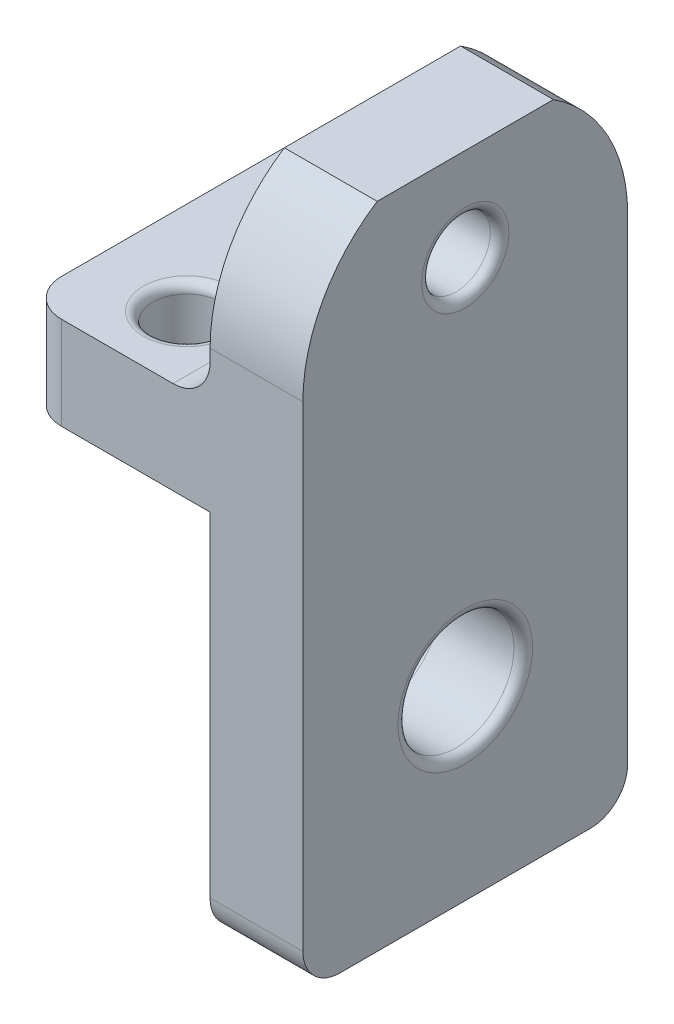
ISO-10303-21;
HEADER;
FILE_DESCRIPTION(('STEP AP214'),'2;1');
FILE_NAME('part.step','',(''),(''),'','','');
FILE_SCHEMA(('AUTOMOTIVE_DESIGN { 1 0 10303 214 1 1 1 1 }'));
ENDSEC;
DATA;
#1=APPLICATION_CONTEXT('core data for automotive mechanical design processes');
#2=APPLICATION_PROTOCOL_DEFINITION('international standard','automotive_design',2000,#1);
#3=PRODUCT_CONTEXT('',#1,'mechanical');
#4=PRODUCT('Part','Part','',(#3));
#5=PRODUCT_RELATED_PRODUCT_CATEGORY('part','',(#4));
#6=PRODUCT_DEFINITION_FORMATION('','',#4);
#7=PRODUCT_DEFINITION_CONTEXT('part definition',#1,'design');
#8=PRODUCT_DEFINITION('design','',#6,#7);
#9=PRODUCT_DEFINITION_SHAPE('','',#8);
#10=(LENGTH_UNIT() NAMED_UNIT(*) SI_UNIT(.MILLI.,.METRE.));
#11=(NAMED_UNIT(*) PLANE_ANGLE_UNIT() SI_UNIT($,.RADIAN.));
#12=(NAMED_UNIT(*) SI_UNIT($,.STERADIAN.) SOLID_ANGLE_UNIT());
#13=UNCERTAINTY_MEASURE_WITH_UNIT(LENGTH_MEASURE(1.E-05),#10,'distance_accuracy_value','');
#14=(GEOMETRIC_REPRESENTATION_CONTEXT(3) GLOBAL_UNCERTAINTY_ASSIGNED_CONTEXT((#13)) GLOBAL_UNIT_ASSIGNED_CONTEXT((#10,
#11,#12)) REPRESENTATION_CONTEXT('',''));
#15=CARTESIAN_POINT('',(0.,0.,0.));
#16=DIRECTION('',(0.,0.,1.));
#17=DIRECTION('',(1.,0.,0.));
#18=AXIS2_PLACEMENT_3D('',#15,#16,#17);
#19=CARTESIAN_POINT('',(0.,0.,-11.1125));
#20=DIRECTION('',(0.,0.,1.));
#21=DIRECTION('',(1.,0.,0.));
#22=AXIS2_PLACEMENT_3D('',#19,#20,#21);
#23=PLANE('',#22);
#24=DIRECTION('',(1.,0.,0.));
#25=VECTOR('',#24,1.);
#26=CARTESIAN_POINT('',(-12.7,9.7155,-11.1125));
#27=LINE('',#26,#25);
#28=CARTESIAN_POINT('',(6.35,9.7155,-11.1125));
#29=VERTEX_POINT('',#28);
#30=CARTESIAN_POINT('',(0.,9.7155,-11.1125));
#31=VERTEX_POINT('',#30);
#32=EDGE_CURVE('E11',#29,#31,#27,.F.);
#33=ORIENTED_EDGE('',*,*,#32,.F.);
#34=DIRECTION('',(0.,1.,0.));
#35=VECTOR('',#34,1.);
#36=CARTESIAN_POINT('',(6.35,19.05,-11.1125));
#37=LINE('',#36,#35);
#38=CARTESIAN_POINT('',(6.35000000000001,-22.86,-11.1125));
#39=VERTEX_POINT('',#38);
#40=EDGE_CURVE('E191',#39,#29,#37,.T.);
#41=ORIENTED_EDGE('',*,*,#40,.F.);
#42=DIRECTION('',(1.,0.,0.));
#43=VECTOR('',#42,1.);
#44=CARTESIAN_POINT('',(0.,-22.86,-11.1125));
#45=LINE('',#44,#43);
#46=CARTESIAN_POINT('',(0.,-22.86,-11.1125));
#47=VERTEX_POINT('',#46);
#48=EDGE_CURVE('E282',#39,#47,#45,.F.);
#49=ORIENTED_EDGE('',*,*,#48,.T.);
#50=DIRECTION('',(0.,-1.,0.));
#51=VECTOR('',#50,1.);
#52=CARTESIAN_POINT('',(0.,-25.4,-11.1125));
#53=LINE('',#52,#51);
#54=CARTESIAN_POINT('',(0.,0.,-11.1125));
#55=VERTEX_POINT('',#54);
#56=EDGE_CURVE('E164',#55,#47,#53,.T.);
#57=ORIENTED_EDGE('',*,*,#56,.F.);
#58=DIRECTION('',(1.,0.,0.));
#59=VECTOR('',#58,1.);
#60=CARTESIAN_POINT('',(0.,0.,-11.1125));
#61=LINE('',#60,#59);
#62=CARTESIAN_POINT('',(-10.16,0.,-11.1125));
#63=VERTEX_POINT('',#62);
#64=EDGE_CURVE('E176',#63,#55,#61,.T.);
#65=ORIENTED_EDGE('',*,*,#64,.F.);
#66=DIRECTION('',(0.,-1.,0.));
#67=VECTOR('',#66,1.);
#68=CARTESIAN_POINT('',(-10.16,0.,-11.1125));
#69=LINE('',#68,#67);
#70=CARTESIAN_POINT('',(-10.16,6.35,-11.1125));
#71=VERTEX_POINT('',#70);
#72=EDGE_CURVE('E279',#63,#71,#69,.F.);
#73=ORIENTED_EDGE('',*,*,#72,.T.);
#74=DIRECTION('',(-1.,0.,0.));
#75=VECTOR('',#74,1.);
#76=CARTESIAN_POINT('',(-12.7,6.35,-11.1125));
#77=LINE('',#76,#75);
#78=CARTESIAN_POINT('',(-2.54,6.35,-11.1125));
#79=VERTEX_POINT('',#78);
#80=EDGE_CURVE('E179',#79,#71,#77,.T.);
#81=ORIENTED_EDGE('',*,*,#80,.F.);
#82=CARTESIAN_POINT('',(-2.54,8.89,-11.1125));
#83=DIRECTION('',(0.,0.,1.));
#84=DIRECTION('',(1.,0.,0.));
#85=AXIS2_PLACEMENT_3D('',#82,#83,#84);
#86=CIRCLE('',#85,2.54);
#87=CARTESIAN_POINT('',(0.,8.89,-11.1125));
#88=VERTEX_POINT('',#87);
#89=EDGE_CURVE('E200',#79,#88,#86,.T.);
#90=ORIENTED_EDGE('',*,*,#89,.T.);
#91=DIRECTION('',(0.,-1.,0.));
#92=VECTOR('',#91,1.);
#93=CARTESIAN_POINT('',(0.,6.35,-11.1125));
#94=LINE('',#93,#92);
#95=EDGE_CURVE('E194',#31,#88,#94,.T.);
#96=ORIENTED_EDGE('',*,*,#95,.F.);
#97=EDGE_LOOP('',(#33,#41,#49,#57,#65,#73,#81,#90,#96));
#98=FACE_BOUND('',#97,.T.);
#99=ADVANCED_FACE('F41',(#98),#23,.F.);
#100=CARTESIAN_POINT('',(0.,-25.4,11.1125));
#101=DIRECTION('',(1.,0.,0.));
#102=DIRECTION('',(0.,0.,-1.));
#103=AXIS2_PLACEMENT_3D('',#100,#101,#102);
#104=PLANE('',#103);
#105=CARTESIAN_POINT('',(0.,-12.7,0.));
#106=DIRECTION('',(1.,0.,0.));
#107=DIRECTION('',(0.,0.,-1.));
#108=AXIS2_PLACEMENT_3D('',#105,#106,#107);
#109=CIRCLE('',#108,4.60375);
#110=CARTESIAN_POINT('',(0.,-12.7,-4.60375));
#111=VERTEX_POINT('',#110);
#112=EDGE_CURVE('E215',#111,#111,#109,.T.);
#113=ORIENTED_EDGE('',*,*,#112,.T.);
#114=EDGE_LOOP('',(#113));
#115=FACE_BOUND('',#114,.T.);
#116=ORIENTED_EDGE('',*,*,#56,.T.);
#117=CARTESIAN_POINT('',(0.,-22.86,-8.5725));
#118=DIRECTION('',(1.,0.,0.));
#119=DIRECTION('',(0.,0.,-1.));
#120=AXIS2_PLACEMENT_3D('',#117,#118,#119);
#121=CIRCLE('',#120,2.54);
#122=CARTESIAN_POINT('',(0.,-25.4,-8.5725));
#123=VERTEX_POINT('',#122);
#124=EDGE_CURVE('E257',#47,#123,#121,.F.);
#125=ORIENTED_EDGE('',*,*,#124,.T.);
#126=DIRECTION('',(0.,0.,-1.));
#127=VECTOR('',#126,1.);
#128=CARTESIAN_POINT('',(0.,-25.4,11.1125));
#129=LINE('',#128,#127);
#130=CARTESIAN_POINT('',(0.,-25.4,8.5725));
#131=VERTEX_POINT('',#130);
#132=EDGE_CURVE('E293',#131,#123,#129,.T.);
#133=ORIENTED_EDGE('',*,*,#132,.F.);
#134=CARTESIAN_POINT('',(0.,-22.86,8.5725));
#135=DIRECTION('',(1.,0.,0.));
#136=DIRECTION('',(0.,0.,-1.));
#137=AXIS2_PLACEMENT_3D('',#134,#135,#136);
#138=CIRCLE('',#137,2.54);
#139=CARTESIAN_POINT('',(0.,-22.86,11.1125));
#140=VERTEX_POINT('',#139);
#141=EDGE_CURVE('E259',#131,#140,#138,.F.);
#142=ORIENTED_EDGE('',*,*,#141,.T.);
#143=DIRECTION('',(0.,-1.,0.));
#144=VECTOR('',#143,1.);
#145=CARTESIAN_POINT('',(0.,-25.4,11.1125));
#146=LINE('',#145,#144);
#147=CARTESIAN_POINT('',(0.,0.,11.1125));
#148=VERTEX_POINT('',#147);
#149=EDGE_CURVE('E173',#148,#140,#146,.T.);
#150=ORIENTED_EDGE('',*,*,#149,.F.);
#151=DIRECTION('',(0.,0.,-1.));
#152=VECTOR('',#151,1.);
#153=CARTESIAN_POINT('',(0.,0.,11.1125));
#154=LINE('',#153,#152);
#155=EDGE_CURVE('E188',#148,#55,#154,.T.);
#156=ORIENTED_EDGE('',*,*,#155,.T.);
#157=EDGE_LOOP('',(#116,#125,#133,#142,#150,#156));
#158=FACE_BOUND('',#157,.T.);
#159=ADVANCED_FACE('F337',(#115,#158),#104,.F.);
#160=CARTESIAN_POINT('',(6.35000000000001,-25.4,11.1125));
#161=DIRECTION('',(0.,1.,0.));
#162=DIRECTION('',(0.,0.,1.));
#163=AXIS2_PLACEMENT_3D('',#160,#161,#162);
#164=PLANE('',#163);
#165=ORIENTED_EDGE('',*,*,#132,.T.);
#166=DIRECTION('',(1.,0.,0.));
#167=VECTOR('',#166,1.);
#168=CARTESIAN_POINT('',(6.35000000000001,-25.4,-8.5725));
#169=LINE('',#168,#167);
#170=CARTESIAN_POINT('',(6.35000000000001,-25.4,-8.5725));
#171=VERTEX_POINT('',#170);
#172=EDGE_CURVE('E265',#123,#171,#169,.T.);
#173=ORIENTED_EDGE('',*,*,#172,.T.);
#174=DIRECTION('',(0.,0.,-1.));
#175=VECTOR('',#174,1.);
#176=CARTESIAN_POINT('',(6.35000000000001,-25.4,11.1125));
#177=LINE('',#176,#175);
#178=CARTESIAN_POINT('',(6.35000000000001,-25.4,8.5725));
#179=VERTEX_POINT('',#178);
#180=EDGE_CURVE('E296',#179,#171,#177,.T.);
#181=ORIENTED_EDGE('',*,*,#180,.F.);
#182=DIRECTION('',(1.,0.,0.));
#183=VECTOR('',#182,1.);
#184=CARTESIAN_POINT('',(0.,-25.4,8.5725));
#185=LINE('',#184,#183);
#186=EDGE_CURVE('E268',#179,#131,#185,.F.);
#187=ORIENTED_EDGE('',*,*,#186,.T.);
#188=EDGE_LOOP('',(#165,#173,#181,#187));
#189=FACE_BOUND('',#188,.T.);
#190=ADVANCED_FACE('F345',(#189),#164,.F.);
#191=CARTESIAN_POINT('',(6.35,19.05,11.1125));
#192=DIRECTION('',(-1.,0.,0.));
#193=DIRECTION('',(0.,-1.,0.));
#194=AXIS2_PLACEMENT_3D('',#191,#192,#193);
#195=PLANE('',#194);
#196=CARTESIAN_POINT('',(6.35,12.7,0.));
#197=DIRECTION('',(-1.,0.,0.));
#198=DIRECTION('',(0.,-1.,0.));
#199=AXIS2_PLACEMENT_3D('',#196,#197,#198);
#200=CIRCLE('',#199,2.9845);
#201=CARTESIAN_POINT('',(6.35,9.7155,0.));
#202=VERTEX_POINT('',#201);
#203=EDGE_CURVE('E227',#202,#202,#200,.T.);
#204=ORIENTED_EDGE('',*,*,#203,.T.);
#205=EDGE_LOOP('',(#204));
#206=FACE_BOUND('',#205,.T.);
#207=CARTESIAN_POINT('',(6.35,-12.7,0.));
#208=DIRECTION('',(-1.,0.,0.));
#209=DIRECTION('',(0.,-1.,0.));
#210=AXIS2_PLACEMENT_3D('',#207,#208,#209);
#211=CIRCLE('',#210,4.60375);
#212=CARTESIAN_POINT('',(6.35,-17.30375,0.));
#213=VERTEX_POINT('',#212);
#214=EDGE_CURVE('E230',#213,#213,#211,.T.);
#215=ORIENTED_EDGE('',*,*,#214,.T.);
#216=EDGE_LOOP('',(#215));
#217=FACE_BOUND('',#216,.T.);
#218=ORIENTED_EDGE('',*,*,#40,.T.);
#219=CARTESIAN_POINT('',(6.35,9.7155,0.));
#220=DIRECTION('',(-1.,0.,0.));
#221=DIRECTION('',(0.,-1.,0.));
#222=AXIS2_PLACEMENT_3D('',#219,#220,#221);
#223=CIRCLE('',#222,11.1125);
#224=CARTESIAN_POINT('',(6.34999999999999,19.05,-6.02949135499836));
#225=VERTEX_POINT('',#224);
#226=EDGE_CURVE('E66',#29,#225,#223,.F.);
#227=ORIENTED_EDGE('',*,*,#226,.T.);
#228=DIRECTION('',(0.,0.,-1.));
#229=VECTOR('',#228,1.);
#230=CARTESIAN_POINT('',(6.35,19.05,11.1125));
#231=LINE('',#230,#229);
#232=CARTESIAN_POINT('',(6.34999999999999,19.05,6.02949135499836));
#233=VERTEX_POINT('',#232);
#234=EDGE_CURVE('E163',#233,#225,#231,.T.);
#235=ORIENTED_EDGE('',*,*,#234,.F.);
#236=CARTESIAN_POINT('',(6.35,9.7155,11.1125));
#237=VERTEX_POINT('',#236);
#238=EDGE_CURVE('E150',#233,#237,#223,.F.);
#239=ORIENTED_EDGE('',*,*,#238,.T.);
#240=DIRECTION('',(0.,1.,0.));
#241=VECTOR('',#240,1.);
#242=CARTESIAN_POINT('',(6.35,19.05,11.1125));
#243=LINE('',#242,#241);
#244=CARTESIAN_POINT('',(6.35000000000001,-22.86,11.1125));
#245=VERTEX_POINT('',#244);
#246=EDGE_CURVE('E45',#245,#237,#243,.T.);
#247=ORIENTED_EDGE('',*,*,#246,.F.);
#248=CARTESIAN_POINT('',(6.35000000000001,-22.86,8.5725));
#249=DIRECTION('',(-1.,0.,0.));
#250=DIRECTION('',(0.,-1.,0.));
#251=AXIS2_PLACEMENT_3D('',#248,#249,#250);
#252=CIRCLE('',#251,2.54);
#253=EDGE_CURVE('E263',#245,#179,#252,.F.);
#254=ORIENTED_EDGE('',*,*,#253,.T.);
#255=ORIENTED_EDGE('',*,*,#180,.T.);
#256=CARTESIAN_POINT('',(6.35000000000001,-22.86,-8.5725));
#257=DIRECTION('',(-1.,0.,0.));
#258=DIRECTION('',(0.,-1.,0.));
#259=AXIS2_PLACEMENT_3D('',#256,#257,#258);
#260=CIRCLE('',#259,2.54);
#261=EDGE_CURVE('E261',#171,#39,#260,.F.);
#262=ORIENTED_EDGE('',*,*,#261,.T.);
#263=EDGE_LOOP('',(#218,#227,#235,#239,#247,#254,#255,#262));
#264=FACE_BOUND('',#263,.T.);
#265=ADVANCED_FACE('F161',(#206,#217,#264),#195,.F.);
#266=CARTESIAN_POINT('',(0.,19.05,11.1125));
#267=DIRECTION('',(0.,-1.,0.));
#268=DIRECTION('',(0.,0.,-1.));
#269=AXIS2_PLACEMENT_3D('',#266,#267,#268);
#270=PLANE('',#269);
#271=ORIENTED_EDGE('',*,*,#234,.T.);
#272=DIRECTION('',(1.,0.,0.));
#273=VECTOR('',#272,1.);
#274=CARTESIAN_POINT('',(-12.7,19.05,-6.02949135499836));
#275=LINE('',#274,#273);
#276=CARTESIAN_POINT('',(0.,19.05,-6.02949135499837));
#277=VERTEX_POINT('',#276);
#278=EDGE_CURVE('E354',#225,#277,#275,.F.);
#279=ORIENTED_EDGE('',*,*,#278,.T.);
#280=DIRECTION('',(0.,0.,-1.));
#281=VECTOR('',#280,1.);
#282=CARTESIAN_POINT('',(0.,19.05,11.1125));
#283=LINE('',#282,#281);
#284=CARTESIAN_POINT('',(0.,19.05,6.02949135499837));
#285=VERTEX_POINT('',#284);
#286=EDGE_CURVE('E300',#285,#277,#283,.T.);
#287=ORIENTED_EDGE('',*,*,#286,.F.);
#288=DIRECTION('',(1.,0.,0.));
#289=VECTOR('',#288,1.);
#290=CARTESIAN_POINT('',(-12.7,19.05,6.02949135499836));
#291=LINE('',#290,#289);
#292=EDGE_CURVE('E165',#285,#233,#291,.T.);
#293=ORIENTED_EDGE('',*,*,#292,.T.);
#294=EDGE_LOOP('',(#271,#279,#287,#293));
#295=FACE_BOUND('',#294,.T.);
#296=ADVANCED_FACE('F358',(#295),#270,.F.);
#297=CARTESIAN_POINT('',(0.,6.35,11.1125));
#298=DIRECTION('',(1.,0.,0.));
#299=DIRECTION('',(0.,0.,-1.));
#300=AXIS2_PLACEMENT_3D('',#297,#298,#299);
#301=PLANE('',#300);
#302=CARTESIAN_POINT('',(0.,12.7,0.));
#303=DIRECTION('',(1.,0.,0.));
#304=DIRECTION('',(0.,0.,-1.));
#305=AXIS2_PLACEMENT_3D('',#302,#303,#304);
#306=CIRCLE('',#305,2.9845);
#307=CARTESIAN_POINT('',(0.,12.7,-2.9845));
#308=VERTEX_POINT('',#307);
#309=EDGE_CURVE('E218',#308,#308,#306,.T.);
#310=ORIENTED_EDGE('',*,*,#309,.T.);
#311=EDGE_LOOP('',(#310));
#312=FACE_BOUND('',#311,.T.);
#313=DIRECTION('',(0.,-1.,0.));
#314=VECTOR('',#313,1.);
#315=CARTESIAN_POINT('',(0.,6.35,11.1125));
#316=LINE('',#315,#314);
#317=CARTESIAN_POINT('',(0.,9.7155,11.1125));
#318=VERTEX_POINT('',#317);
#319=CARTESIAN_POINT('',(0.,8.89,11.1125));
#320=VERTEX_POINT('',#319);
#321=EDGE_CURVE('E172',#318,#320,#316,.T.);
#322=ORIENTED_EDGE('',*,*,#321,.F.);
#323=CARTESIAN_POINT('',(0.,9.7155,0.));
#324=DIRECTION('',(1.,0.,0.));
#325=DIRECTION('',(0.,0.,-1.));
#326=AXIS2_PLACEMENT_3D('',#323,#324,#325);
#327=CIRCLE('',#326,11.1125);
#328=EDGE_CURVE('E59',#318,#285,#327,.F.);
#329=ORIENTED_EDGE('',*,*,#328,.T.);
#330=ORIENTED_EDGE('',*,*,#286,.T.);
#331=EDGE_CURVE('E155',#277,#31,#327,.F.);
#332=ORIENTED_EDGE('',*,*,#331,.T.);
#333=ORIENTED_EDGE('',*,*,#95,.T.);
#334=DIRECTION('',(0.,0.,-1.));
#335=VECTOR('',#334,1.);
#336=CARTESIAN_POINT('',(0.,8.89,11.1125));
#337=LINE('',#336,#335);
#338=EDGE_CURVE('E203',#88,#320,#337,.F.);
#339=ORIENTED_EDGE('',*,*,#338,.T.);
#340=EDGE_LOOP('',(#322,#329,#330,#332,#333,#339));
#341=FACE_BOUND('',#340,.T.);
#342=ADVANCED_FACE('F315',(#312,#341),#301,.F.);
#343=CARTESIAN_POINT('',(-12.7,6.35,11.1125));
#344=DIRECTION('',(0.,-1.,0.));
#345=DIRECTION('',(0.,0.,-1.));
#346=AXIS2_PLACEMENT_3D('',#343,#344,#345);
#347=PLANE('',#346);
#348=CARTESIAN_POINT('',(-6.35,6.35,6.35));
#349=DIRECTION('',(0.,-1.,0.));
#350=DIRECTION('',(0.,0.,-1.));
#351=AXIS2_PLACEMENT_3D('',#348,#349,#350);
#352=CIRCLE('',#351,2.9718);
#353=CARTESIAN_POINT('',(-6.35,6.35,3.3782));
#354=VERTEX_POINT('',#353);
#355=EDGE_CURVE('E251',#354,#354,#352,.T.);
#356=ORIENTED_EDGE('',*,*,#355,.T.);
#357=EDGE_LOOP('',(#356));
#358=FACE_BOUND('',#357,.T.);
#359=CARTESIAN_POINT('',(-6.35,6.35,-6.35));
#360=DIRECTION('',(0.,-1.,0.));
#361=DIRECTION('',(0.,0.,-1.));
#362=AXIS2_PLACEMENT_3D('',#359,#360,#361);
#363=CIRCLE('',#362,2.9718);
#364=CARTESIAN_POINT('',(-6.35,6.35,-9.3218));
#365=VERTEX_POINT('',#364);
#366=EDGE_CURVE('E254',#365,#365,#363,.T.);
#367=ORIENTED_EDGE('',*,*,#366,.T.);
#368=EDGE_LOOP('',(#367));
#369=FACE_BOUND('',#368,.T.);
#370=DIRECTION('',(-1.,0.,0.));
#371=VECTOR('',#370,1.);
#372=CARTESIAN_POINT('',(-12.7,6.35,11.1125));
#373=LINE('',#372,#371);
#374=CARTESIAN_POINT('',(-2.54,6.35,11.1125));
#375=VERTEX_POINT('',#374);
#376=CARTESIAN_POINT('',(-10.16,6.35,11.1125));
#377=VERTEX_POINT('',#376);
#378=EDGE_CURVE('E174',#375,#377,#373,.T.);
#379=ORIENTED_EDGE('',*,*,#378,.F.);
#380=DIRECTION('',(0.,0.,-1.));
#381=VECTOR('',#380,1.);
#382=CARTESIAN_POINT('',(-2.54,6.35,-11.1125));
#383=LINE('',#382,#381);
#384=EDGE_CURVE('E206',#375,#79,#383,.T.);
#385=ORIENTED_EDGE('',*,*,#384,.T.);
#386=ORIENTED_EDGE('',*,*,#80,.T.);
#387=CARTESIAN_POINT('',(-10.16,6.35,-8.5725));
#388=DIRECTION('',(0.,-1.,0.));
#389=DIRECTION('',(0.,0.,-1.));
#390=AXIS2_PLACEMENT_3D('',#387,#388,#389);
#391=CIRCLE('',#390,2.54);
#392=CARTESIAN_POINT('',(-12.7,6.35,-8.5725));
#393=VERTEX_POINT('',#392);
#394=EDGE_CURVE('E274',#71,#393,#391,.F.);
#395=ORIENTED_EDGE('',*,*,#394,.T.);
#396=DIRECTION('',(0.,0.,-1.));
#397=VECTOR('',#396,1.);
#398=CARTESIAN_POINT('',(-12.7,6.35,11.1125));
#399=LINE('',#398,#397);
#400=CARTESIAN_POINT('',(-12.7,6.35,8.5725));
#401=VERTEX_POINT('',#400);
#402=EDGE_CURVE('E303',#401,#393,#399,.T.);
#403=ORIENTED_EDGE('',*,*,#402,.F.);
#404=CARTESIAN_POINT('',(-10.16,6.35,8.5725));
#405=DIRECTION('',(0.,-1.,0.));
#406=DIRECTION('',(0.,0.,-1.));
#407=AXIS2_PLACEMENT_3D('',#404,#405,#406);
#408=CIRCLE('',#407,2.54);
#409=EDGE_CURVE('E276',#401,#377,#408,.F.);
#410=ORIENTED_EDGE('',*,*,#409,.T.);
#411=EDGE_LOOP('',(#379,#385,#386,#395,#403,#410));
#412=FACE_BOUND('',#411,.T.);
#413=ADVANCED_FACE('F322',(#358,#369,#412),#347,.F.);
#414=CARTESIAN_POINT('',(-12.7,0.,11.1125));
#415=DIRECTION('',(1.,0.,0.));
#416=DIRECTION('',(0.,0.,-1.));
#417=AXIS2_PLACEMENT_3D('',#414,#415,#416);
#418=PLANE('',#417);
#419=ORIENTED_EDGE('',*,*,#402,.T.);
#420=DIRECTION('',(0.,-1.,0.));
#421=VECTOR('',#420,1.);
#422=CARTESIAN_POINT('',(-12.7,0.,-8.5725));
#423=LINE('',#422,#421);
#424=CARTESIAN_POINT('',(-12.7,0.,-8.5725));
#425=VERTEX_POINT('',#424);
#426=EDGE_CURVE('E288',#393,#425,#423,.T.);
#427=ORIENTED_EDGE('',*,*,#426,.T.);
#428=DIRECTION('',(0.,0.,-1.));
#429=VECTOR('',#428,1.);
#430=CARTESIAN_POINT('',(-12.7,0.,11.1125));
#431=LINE('',#430,#429);
#432=CARTESIAN_POINT('',(-12.7,0.,8.5725));
#433=VERTEX_POINT('',#432);
#434=EDGE_CURVE('E306',#433,#425,#431,.T.);
#435=ORIENTED_EDGE('',*,*,#434,.F.);
#436=DIRECTION('',(0.,-1.,0.));
#437=VECTOR('',#436,1.);
#438=CARTESIAN_POINT('',(-12.7,6.35,8.5725));
#439=LINE('',#438,#437);
#440=EDGE_CURVE('E291',#433,#401,#439,.F.);
#441=ORIENTED_EDGE('',*,*,#440,.T.);
#442=EDGE_LOOP('',(#419,#427,#435,#441));
#443=FACE_BOUND('',#442,.T.);
#444=ADVANCED_FACE('F388',(#443),#418,.F.);
#445=CARTESIAN_POINT('',(0.,0.,11.1125));
#446=DIRECTION('',(0.,1.,0.));
#447=DIRECTION('',(0.,0.,1.));
#448=AXIS2_PLACEMENT_3D('',#445,#446,#447);
#449=PLANE('',#448);
#450=CARTESIAN_POINT('',(-6.35,0.,6.35));
#451=DIRECTION('',(0.,1.,0.));
#452=DIRECTION('',(0.,0.,1.));
#453=AXIS2_PLACEMENT_3D('',#450,#451,#452);
#454=CIRCLE('',#453,2.9718);
#455=CARTESIAN_POINT('',(-6.35,0.,9.3218));
#456=VERTEX_POINT('',#455);
#457=EDGE_CURVE('E239',#456,#456,#454,.T.);
#458=ORIENTED_EDGE('',*,*,#457,.T.);
#459=EDGE_LOOP('',(#458));
#460=FACE_BOUND('',#459,.T.);
#461=CARTESIAN_POINT('',(-6.35,0.,-6.35));
#462=DIRECTION('',(0.,1.,0.));
#463=DIRECTION('',(0.,0.,1.));
#464=AXIS2_PLACEMENT_3D('',#461,#462,#463);
#465=CIRCLE('',#464,2.9718);
#466=CARTESIAN_POINT('',(-6.35,0.,-3.3782));
#467=VERTEX_POINT('',#466);
#468=EDGE_CURVE('E242',#467,#467,#465,.T.);
#469=ORIENTED_EDGE('',*,*,#468,.T.);
#470=EDGE_LOOP('',(#469));
#471=FACE_BOUND('',#470,.T.);
#472=ORIENTED_EDGE('',*,*,#434,.T.);
#473=CARTESIAN_POINT('',(-10.16,0.,-8.5725));
#474=DIRECTION('',(0.,1.,0.));
#475=DIRECTION('',(0.,0.,1.));
#476=AXIS2_PLACEMENT_3D('',#473,#474,#475);
#477=CIRCLE('',#476,2.54);
#478=EDGE_CURVE('E284',#425,#63,#477,.F.);
#479=ORIENTED_EDGE('',*,*,#478,.T.);
#480=ORIENTED_EDGE('',*,*,#64,.T.);
#481=ORIENTED_EDGE('',*,*,#155,.F.);
#482=DIRECTION('',(1.,0.,0.));
#483=VECTOR('',#482,1.);
#484=CARTESIAN_POINT('',(0.,0.,11.1125));
#485=LINE('',#484,#483);
#486=CARTESIAN_POINT('',(-10.16,0.,11.1125));
#487=VERTEX_POINT('',#486);
#488=EDGE_CURVE('E186',#487,#148,#485,.T.);
#489=ORIENTED_EDGE('',*,*,#488,.F.);
#490=CARTESIAN_POINT('',(-10.16,0.,8.5725));
#491=DIRECTION('',(0.,1.,0.));
#492=DIRECTION('',(0.,0.,1.));
#493=AXIS2_PLACEMENT_3D('',#490,#491,#492);
#494=CIRCLE('',#493,2.54);
#495=EDGE_CURVE('E286',#487,#433,#494,.F.);
#496=ORIENTED_EDGE('',*,*,#495,.T.);
#497=EDGE_LOOP('',(#472,#479,#480,#481,#489,#496));
#498=FACE_BOUND('',#497,.T.);
#499=ADVANCED_FACE('F332',(#460,#471,#498),#449,.F.);
#500=CARTESIAN_POINT('',(0.,0.,11.1125));
#501=DIRECTION('',(0.,0.,1.));
#502=DIRECTION('',(1.,0.,0.));
#503=AXIS2_PLACEMENT_3D('',#500,#501,#502);
#504=PLANE('',#503);
#505=DIRECTION('',(1.,0.,0.));
#506=VECTOR('',#505,1.);
#507=CARTESIAN_POINT('',(-12.7,9.7155,11.1125));
#508=LINE('',#507,#506);
#509=EDGE_CURVE('E147',#318,#237,#508,.T.);
#510=ORIENTED_EDGE('',*,*,#509,.F.);
#511=ORIENTED_EDGE('',*,*,#321,.T.);
#512=CARTESIAN_POINT('',(-2.54,8.89,11.1125));
#513=DIRECTION('',(0.,0.,1.));
#514=DIRECTION('',(1.,0.,0.));
#515=AXIS2_PLACEMENT_3D('',#512,#513,#514);
#516=CIRCLE('',#515,2.54);
#517=EDGE_CURVE('E51',#320,#375,#516,.F.);
#518=ORIENTED_EDGE('',*,*,#517,.T.);
#519=ORIENTED_EDGE('',*,*,#378,.T.);
#520=DIRECTION('',(0.,-1.,0.));
#521=VECTOR('',#520,1.);
#522=CARTESIAN_POINT('',(-10.16,0.,11.1125));
#523=LINE('',#522,#521);
#524=EDGE_CURVE('E270',#377,#487,#523,.T.);
#525=ORIENTED_EDGE('',*,*,#524,.T.);
#526=ORIENTED_EDGE('',*,*,#488,.T.);
#527=ORIENTED_EDGE('',*,*,#149,.T.);
#528=DIRECTION('',(1.,0.,0.));
#529=VECTOR('',#528,1.);
#530=CARTESIAN_POINT('',(6.35000000000001,-22.86,11.1125));
#531=LINE('',#530,#529);
#532=EDGE_CURVE('E171',#140,#245,#531,.T.);
#533=ORIENTED_EDGE('',*,*,#532,.T.);
#534=ORIENTED_EDGE('',*,*,#246,.T.);
#535=EDGE_LOOP('',(#510,#511,#518,#519,#525,#526,#527,#533,#534));
#536=FACE_BOUND('',#535,.T.);
#537=ADVANCED_FACE('F168',(#536),#504,.T.);
#538=CARTESIAN_POINT('',(-6.35,-25.4,6.35));
#539=DIRECTION('',(0.,1.,0.));
#540=DIRECTION('',(0.,0.,1.));
#541=AXIS2_PLACEMENT_3D('',#538,#539,#540);
#542=CYLINDRICAL_SURFACE('',#541,2.3368);
#543=CARTESIAN_POINT('',(-6.35,5.715,6.35));
#544=DIRECTION('',(0.,-1.,0.));
#545=DIRECTION('',(0.,0.,-1.));
#546=AXIS2_PLACEMENT_3D('',#543,#544,#545);
#547=CIRCLE('',#546,2.3368);
#548=CARTESIAN_POINT('',(-6.35,5.715,4.0132));
#549=VERTEX_POINT('',#548);
#550=EDGE_CURVE('E245',#549,#549,#547,.F.);
#551=ORIENTED_EDGE('',*,*,#550,.T.);
#552=EDGE_LOOP('',(#551));
#553=FACE_BOUND('',#552,.T.);
#554=CARTESIAN_POINT('',(-6.35,0.635,6.35));
#555=DIRECTION('',(0.,1.,0.));
#556=DIRECTION('',(0.,0.,1.));
#557=AXIS2_PLACEMENT_3D('',#554,#555,#556);
#558=CIRCLE('',#557,2.3368);
#559=CARTESIAN_POINT('',(-6.35,0.635,8.6868));
#560=VERTEX_POINT('',#559);
#561=EDGE_CURVE('E248',#560,#560,#558,.F.);
#562=ORIENTED_EDGE('',*,*,#561,.T.);
#563=EDGE_LOOP('',(#562));
#564=FACE_BOUND('',#563,.T.);
#565=ADVANCED_FACE('F459',(#553,#564),#542,.F.);
#566=CARTESIAN_POINT('',(-6.35,-25.4,-6.35));
#567=DIRECTION('',(0.,1.,0.));
#568=DIRECTION('',(0.,0.,1.));
#569=AXIS2_PLACEMENT_3D('',#566,#567,#568);
#570=CYLINDRICAL_SURFACE('',#569,2.3368);
#571=CARTESIAN_POINT('',(-6.35,5.715,-6.35));
#572=DIRECTION('',(0.,-1.,0.));
#573=DIRECTION('',(0.,0.,-1.));
#574=AXIS2_PLACEMENT_3D('',#571,#572,#573);
#575=CIRCLE('',#574,2.3368);
#576=CARTESIAN_POINT('',(-6.35,5.715,-8.6868));
#577=VERTEX_POINT('',#576);
#578=EDGE_CURVE('E233',#577,#577,#575,.F.);
#579=ORIENTED_EDGE('',*,*,#578,.T.);
#580=EDGE_LOOP('',(#579));
#581=FACE_BOUND('',#580,.T.);
#582=CARTESIAN_POINT('',(-6.35,0.635,-6.35));
#583=DIRECTION('',(0.,1.,0.));
#584=DIRECTION('',(0.,0.,1.));
#585=AXIS2_PLACEMENT_3D('',#582,#583,#584);
#586=CIRCLE('',#585,2.3368);
#587=CARTESIAN_POINT('',(-6.35,0.635,-4.0132));
#588=VERTEX_POINT('',#587);
#589=EDGE_CURVE('E236',#588,#588,#586,.F.);
#590=ORIENTED_EDGE('',*,*,#589,.T.);
#591=EDGE_LOOP('',(#590));
#592=FACE_BOUND('',#591,.T.);
#593=ADVANCED_FACE('F453',(#581,#592),#570,.F.);
#594=CARTESIAN_POINT('',(-12.7,12.7,0.));
#595=DIRECTION('',(1.,0.,0.));
#596=DIRECTION('',(0.,1.,0.));
#597=AXIS2_PLACEMENT_3D('',#594,#595,#596);
#598=CYLINDRICAL_SURFACE('',#597,2.3495);
#599=CARTESIAN_POINT('',(5.715,12.7,0.));
#600=DIRECTION('',(-1.,0.,0.));
#601=DIRECTION('',(0.,-1.,0.));
#602=AXIS2_PLACEMENT_3D('',#599,#600,#601);
#603=CIRCLE('',#602,2.3495);
#604=CARTESIAN_POINT('',(5.715,10.3505,0.));
#605=VERTEX_POINT('',#604);
#606=EDGE_CURVE('E221',#605,#605,#603,.F.);
#607=ORIENTED_EDGE('',*,*,#606,.T.);
#608=EDGE_LOOP('',(#607));
#609=FACE_BOUND('',#608,.T.);
#610=CARTESIAN_POINT('',(0.635,12.7,0.));
#611=DIRECTION('',(1.,0.,0.));
#612=DIRECTION('',(0.,0.,-1.));
#613=AXIS2_PLACEMENT_3D('',#610,#611,#612);
#614=CIRCLE('',#613,2.3495);
#615=CARTESIAN_POINT('',(0.635,12.7,-2.3495));
#616=VERTEX_POINT('',#615);
#617=EDGE_CURVE('E224',#616,#616,#614,.F.);
#618=ORIENTED_EDGE('',*,*,#617,.T.);
#619=EDGE_LOOP('',(#618));
#620=FACE_BOUND('',#619,.T.);
#621=ADVANCED_FACE('F443',(#609,#620),#598,.F.);
#622=CARTESIAN_POINT('',(-12.7,-12.7,0.));
#623=DIRECTION('',(1.,0.,0.));
#624=DIRECTION('',(0.,1.,0.));
#625=AXIS2_PLACEMENT_3D('',#622,#623,#624);
#626=CYLINDRICAL_SURFACE('',#625,3.96875);
#627=CARTESIAN_POINT('',(0.635,-12.7,0.));
#628=DIRECTION('',(1.,0.,0.));
#629=DIRECTION('',(0.,0.,-1.));
#630=AXIS2_PLACEMENT_3D('',#627,#628,#629);
#631=CIRCLE('',#630,3.96875);
#632=CARTESIAN_POINT('',(0.635,-12.7,-3.96875));
#633=VERTEX_POINT('',#632);
#634=EDGE_CURVE('E209',#633,#633,#631,.F.);
#635=ORIENTED_EDGE('',*,*,#634,.T.);
#636=EDGE_LOOP('',(#635));
#637=FACE_BOUND('',#636,.T.);
#638=CARTESIAN_POINT('',(5.715,-12.7,0.));
#639=DIRECTION('',(-1.,0.,0.));
#640=DIRECTION('',(0.,-1.,0.));
#641=AXIS2_PLACEMENT_3D('',#638,#639,#640);
#642=CIRCLE('',#641,3.96875);
#643=CARTESIAN_POINT('',(5.715,-16.66875,0.));
#644=VERTEX_POINT('',#643);
#645=EDGE_CURVE('E212',#644,#644,#642,.F.);
#646=ORIENTED_EDGE('',*,*,#645,.T.);
#647=EDGE_LOOP('',(#646));
#648=FACE_BOUND('',#647,.T.);
#649=ADVANCED_FACE('F440',(#637,#648),#626,.F.);
#650=CARTESIAN_POINT('',(-10.16,0.,-8.5725));
#651=DIRECTION('',(0.,-1.,0.));
#652=DIRECTION('',(0.,0.,-1.));
#653=AXIS2_PLACEMENT_3D('',#650,#651,#652);
#654=CYLINDRICAL_SURFACE('',#653,2.54);
#655=ORIENTED_EDGE('',*,*,#394,.F.);
#656=ORIENTED_EDGE('',*,*,#72,.F.);
#657=ORIENTED_EDGE('',*,*,#478,.F.);
#658=ORIENTED_EDGE('',*,*,#426,.F.);
#659=EDGE_LOOP('',(#655,#656,#657,#658));
#660=FACE_BOUND('',#659,.T.);
#661=ADVANCED_FACE('F442',(#660),#654,.T.);
#662=CARTESIAN_POINT('',(-10.16,0.,8.5725));
#663=DIRECTION('',(0.,1.,0.));
#664=DIRECTION('',(0.,0.,1.));
#665=AXIS2_PLACEMENT_3D('',#662,#663,#664);
#666=CYLINDRICAL_SURFACE('',#665,2.54);
#667=ORIENTED_EDGE('',*,*,#409,.F.);
#668=ORIENTED_EDGE('',*,*,#440,.F.);
#669=ORIENTED_EDGE('',*,*,#495,.F.);
#670=ORIENTED_EDGE('',*,*,#524,.F.);
#671=EDGE_LOOP('',(#667,#668,#669,#670));
#672=FACE_BOUND('',#671,.T.);
#673=ADVANCED_FACE('F328',(#672),#666,.T.);
#674=CARTESIAN_POINT('',(6.35000000000001,-22.86,-8.5725));
#675=DIRECTION('',(1.,0.,0.));
#676=DIRECTION('',(0.,0.,-1.));
#677=AXIS2_PLACEMENT_3D('',#674,#675,#676);
#678=CYLINDRICAL_SURFACE('',#677,2.54);
#679=ORIENTED_EDGE('',*,*,#124,.F.);
#680=ORIENTED_EDGE('',*,*,#48,.F.);
#681=ORIENTED_EDGE('',*,*,#261,.F.);
#682=ORIENTED_EDGE('',*,*,#172,.F.);
#683=EDGE_LOOP('',(#679,#680,#681,#682));
#684=FACE_BOUND('',#683,.T.);
#685=ADVANCED_FACE('F349',(#684),#678,.T.);
#686=CARTESIAN_POINT('',(0.,-22.86,8.5725));
#687=DIRECTION('',(-1.,0.,0.));
#688=DIRECTION('',(0.,0.,1.));
#689=AXIS2_PLACEMENT_3D('',#686,#687,#688);
#690=CYLINDRICAL_SURFACE('',#689,2.54);
#691=ORIENTED_EDGE('',*,*,#141,.F.);
#692=ORIENTED_EDGE('',*,*,#186,.F.);
#693=ORIENTED_EDGE('',*,*,#253,.F.);
#694=ORIENTED_EDGE('',*,*,#532,.F.);
#695=EDGE_LOOP('',(#691,#692,#693,#694));
#696=FACE_BOUND('',#695,.T.);
#697=ADVANCED_FACE('F342',(#696),#690,.T.);
#698=CARTESIAN_POINT('',(-6.35,5.715,6.35));
#699=DIRECTION('',(0.,-1.,0.));
#700=DIRECTION('',(0.,0.,-1.));
#701=AXIS2_PLACEMENT_3D('',#698,#699,#700);
#702=TOROIDAL_SURFACE('',#701,2.9718,0.635);
#703=ORIENTED_EDGE('',*,*,#550,.F.);
#704=EDGE_LOOP('',(#703));
#705=FACE_BOUND('',#704,.T.);
#706=ORIENTED_EDGE('',*,*,#355,.F.);
#707=EDGE_LOOP('',(#706));
#708=FACE_BOUND('',#707,.T.);
#709=ADVANCED_FACE('F415',(#705,#708),#702,.T.);
#710=CARTESIAN_POINT('',(-6.35,0.635,6.35));
#711=DIRECTION('',(0.,1.,0.));
#712=DIRECTION('',(0.,0.,1.));
#713=AXIS2_PLACEMENT_3D('',#710,#711,#712);
#714=TOROIDAL_SURFACE('',#713,2.9718,0.635);
#715=ORIENTED_EDGE('',*,*,#561,.F.);
#716=EDGE_LOOP('',(#715));
#717=FACE_BOUND('',#716,.T.);
#718=ORIENTED_EDGE('',*,*,#457,.F.);
#719=EDGE_LOOP('',(#718));
#720=FACE_BOUND('',#719,.T.);
#721=ADVANCED_FACE('F405',(#717,#720),#714,.T.);
#722=CARTESIAN_POINT('',(-6.35,5.715,-6.35));
#723=DIRECTION('',(0.,-1.,0.));
#724=DIRECTION('',(0.,0.,-1.));
#725=AXIS2_PLACEMENT_3D('',#722,#723,#724);
#726=TOROIDAL_SURFACE('',#725,2.9718,0.635);
#727=ORIENTED_EDGE('',*,*,#578,.F.);
#728=EDGE_LOOP('',(#727));
#729=FACE_BOUND('',#728,.T.);
#730=ORIENTED_EDGE('',*,*,#366,.F.);
#731=EDGE_LOOP('',(#730));
#732=FACE_BOUND('',#731,.T.);
#733=ADVANCED_FACE('F402',(#729,#732),#726,.T.);
#734=CARTESIAN_POINT('',(-6.35,0.635,-6.35));
#735=DIRECTION('',(0.,1.,0.));
#736=DIRECTION('',(0.,0.,1.));
#737=AXIS2_PLACEMENT_3D('',#734,#735,#736);
#738=TOROIDAL_SURFACE('',#737,2.9718,0.635);
#739=ORIENTED_EDGE('',*,*,#589,.F.);
#740=EDGE_LOOP('',(#739));
#741=FACE_BOUND('',#740,.T.);
#742=ORIENTED_EDGE('',*,*,#468,.F.);
#743=EDGE_LOOP('',(#742));
#744=FACE_BOUND('',#743,.T.);
#745=ADVANCED_FACE('F404',(#741,#744),#738,.T.);
#746=CARTESIAN_POINT('',(5.715,12.7,0.));
#747=DIRECTION('',(-1.,0.,0.));
#748=DIRECTION('',(0.,-1.,0.));
#749=AXIS2_PLACEMENT_3D('',#746,#747,#748);
#750=TOROIDAL_SURFACE('',#749,2.9845,0.635);
#751=ORIENTED_EDGE('',*,*,#606,.F.);
#752=EDGE_LOOP('',(#751));
#753=FACE_BOUND('',#752,.T.);
#754=ORIENTED_EDGE('',*,*,#203,.F.);
#755=EDGE_LOOP('',(#754));
#756=FACE_BOUND('',#755,.T.);
#757=ADVANCED_FACE('F412',(#753,#756),#750,.T.);
#758=CARTESIAN_POINT('',(0.635,12.7,0.));
#759=DIRECTION('',(1.,0.,0.));
#760=DIRECTION('',(0.,0.,-1.));
#761=AXIS2_PLACEMENT_3D('',#758,#759,#760);
#762=TOROIDAL_SURFACE('',#761,2.9845,0.635);
#763=ORIENTED_EDGE('',*,*,#617,.F.);
#764=EDGE_LOOP('',(#763));
#765=FACE_BOUND('',#764,.T.);
#766=ORIENTED_EDGE('',*,*,#309,.F.);
#767=EDGE_LOOP('',(#766));
#768=FACE_BOUND('',#767,.T.);
#769=ADVANCED_FACE('F423',(#765,#768),#762,.T.);
#770=CARTESIAN_POINT('',(0.635,-12.7,0.));
#771=DIRECTION('',(1.,0.,0.));
#772=DIRECTION('',(0.,0.,-1.));
#773=AXIS2_PLACEMENT_3D('',#770,#771,#772);
#774=TOROIDAL_SURFACE('',#773,4.60375,0.635);
#775=ORIENTED_EDGE('',*,*,#634,.F.);
#776=EDGE_LOOP('',(#775));
#777=FACE_BOUND('',#776,.T.);
#778=ORIENTED_EDGE('',*,*,#112,.F.);
#779=EDGE_LOOP('',(#778));
#780=FACE_BOUND('',#779,.T.);
#781=ADVANCED_FACE('F427',(#777,#780),#774,.T.);
#782=CARTESIAN_POINT('',(5.715,-12.7,0.));
#783=DIRECTION('',(-1.,0.,0.));
#784=DIRECTION('',(0.,-1.,0.));
#785=AXIS2_PLACEMENT_3D('',#782,#783,#784);
#786=TOROIDAL_SURFACE('',#785,4.60375,0.635);
#787=ORIENTED_EDGE('',*,*,#645,.F.);
#788=EDGE_LOOP('',(#787));
#789=FACE_BOUND('',#788,.T.);
#790=ORIENTED_EDGE('',*,*,#214,.F.);
#791=EDGE_LOOP('',(#790));
#792=FACE_BOUND('',#791,.T.);
#793=ADVANCED_FACE('F430',(#789,#792),#786,.T.);
#794=CARTESIAN_POINT('',(-2.54,8.89,11.1125));
#795=DIRECTION('',(0.,0.,1.));
#796=DIRECTION('',(1.,0.,0.));
#797=AXIS2_PLACEMENT_3D('',#794,#795,#796);
#798=CYLINDRICAL_SURFACE('',#797,2.54);
#799=ORIENTED_EDGE('',*,*,#517,.F.);
#800=ORIENTED_EDGE('',*,*,#338,.F.);
#801=ORIENTED_EDGE('',*,*,#89,.F.);
#802=ORIENTED_EDGE('',*,*,#384,.F.);
#803=EDGE_LOOP('',(#799,#800,#801,#802));
#804=FACE_BOUND('',#803,.T.);
#805=ADVANCED_FACE('F43',(#804),#798,.F.);
#806=CARTESIAN_POINT('',(-12.7,9.7155,0.));
#807=DIRECTION('',(1.,0.,0.));
#808=DIRECTION('',(0.,1.,0.));
#809=AXIS2_PLACEMENT_3D('',#806,#807,#808);
#810=CYLINDRICAL_SURFACE('',#809,11.1125);
#811=ORIENTED_EDGE('',*,*,#32,.T.);
#812=ORIENTED_EDGE('',*,*,#331,.F.);
#813=ORIENTED_EDGE('',*,*,#278,.F.);
#814=ORIENTED_EDGE('',*,*,#226,.F.);
#815=EDGE_LOOP('',(#811,#812,#813,#814));
#816=FACE_BOUND('',#815,.T.);
#817=ADVANCED_FACE('F352',(#816),#810,.T.);
#818=ORIENTED_EDGE('',*,*,#292,.F.);
#819=ORIENTED_EDGE('',*,*,#328,.F.);
#820=ORIENTED_EDGE('',*,*,#509,.T.);
#821=ORIENTED_EDGE('',*,*,#238,.F.);
#822=EDGE_LOOP('',(#818,#819,#820,#821));
#823=FACE_BOUND('',#822,.T.);
#824=ADVANCED_FACE('F149',(#823),#810,.T.);
#825=CLOSED_SHELL('',(#99,#159,#190,#265,#296,#342,#413,#444,#499,#537,#565,#593,#621,#649,#661,
#673,#685,#697,#709,#721,#733,#745,#757,#769,#781,#793,#805,#817,#824));
#826=MANIFOLD_SOLID_BREP('B2',#825);
#827=ADVANCED_BREP_SHAPE_REPRESENTATION('',(#18,#826),#14);
#828=SHAPE_DEFINITION_REPRESENTATION(#9,#827);
ENDSEC;
END-ISO-10303-21;
